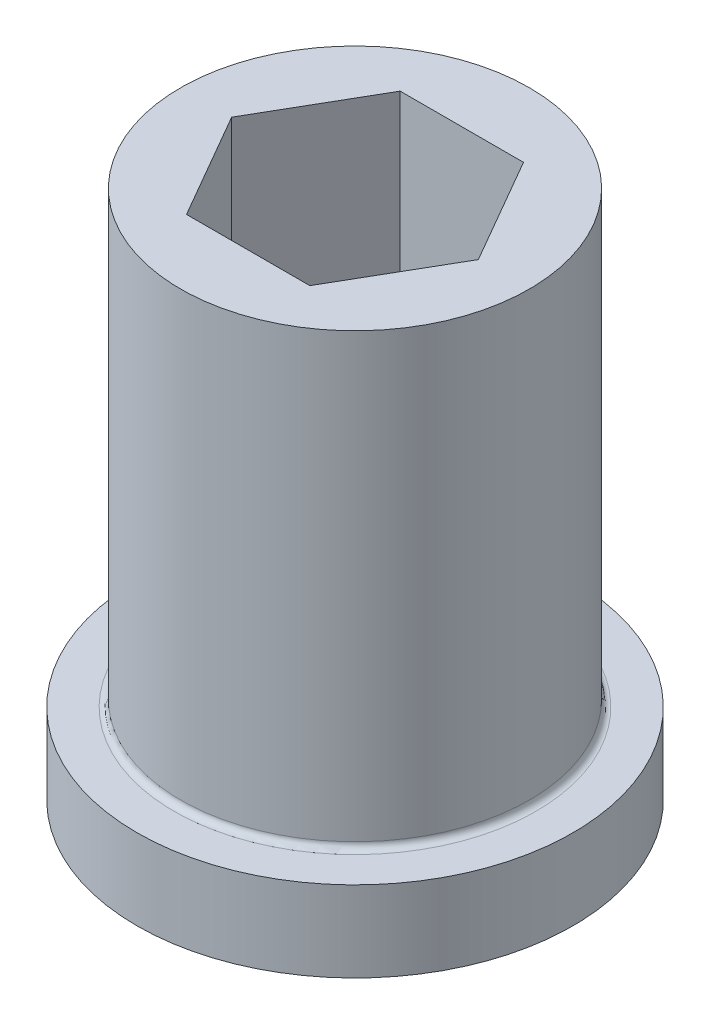
ISO-10303-21;
HEADER;
FILE_DESCRIPTION(('STEP AP214'),'2;1');
FILE_NAME('part.step','',(''),(''),'','','');
FILE_SCHEMA(('AUTOMOTIVE_DESIGN { 1 0 10303 214 1 1 1 1 }'));
ENDSEC;
DATA;
#1=APPLICATION_CONTEXT('core data for automotive mechanical design processes');
#2=APPLICATION_PROTOCOL_DEFINITION('international standard','automotive_design',2000,#1);
#3=PRODUCT_CONTEXT('',#1,'mechanical');
#4=PRODUCT('Part','Part','',(#3));
#5=PRODUCT_RELATED_PRODUCT_CATEGORY('part','',(#4));
#6=PRODUCT_DEFINITION_FORMATION('','',#4);
#7=PRODUCT_DEFINITION_CONTEXT('part definition',#1,'design');
#8=PRODUCT_DEFINITION('design','',#6,#7);
#9=PRODUCT_DEFINITION_SHAPE('','',#8);
#10=(LENGTH_UNIT() NAMED_UNIT(*) SI_UNIT(.MILLI.,.METRE.));
#11=(NAMED_UNIT(*) PLANE_ANGLE_UNIT() SI_UNIT($,.RADIAN.));
#12=(NAMED_UNIT(*) SI_UNIT($,.STERADIAN.) SOLID_ANGLE_UNIT());
#13=UNCERTAINTY_MEASURE_WITH_UNIT(LENGTH_MEASURE(1.E-05),#10,'distance_accuracy_value','');
#14=(GEOMETRIC_REPRESENTATION_CONTEXT(3) GLOBAL_UNCERTAINTY_ASSIGNED_CONTEXT((#13)) GLOBAL_UNIT_ASSIGNED_CONTEXT((#10,
#11,#12)) REPRESENTATION_CONTEXT('',''));
#15=CARTESIAN_POINT('',(0.,0.,0.));
#16=DIRECTION('',(0.,0.,1.));
#17=DIRECTION('',(1.,0.,0.));
#18=AXIS2_PLACEMENT_3D('',#15,#16,#17);
#19=CARTESIAN_POINT('',(0.,10.3,0.));
#20=DIRECTION('',(0.,1.,0.));
#21=DIRECTION('',(0.,0.,1.));
#22=AXIS2_PLACEMENT_3D('',#19,#20,#21);
#23=PLANE('',#22);
#24=CARTESIAN_POINT('',(0.,10.3,0.));
#25=DIRECTION('',(0.,1.,0.));
#26=DIRECTION('',(0.,0.,1.));
#27=AXIS2_PLACEMENT_3D('',#24,#25,#26);
#28=CIRCLE('',#27,4.);
#29=CARTESIAN_POINT('',(0.,10.3,-4.));
#30=VERTEX_POINT('',#29);
#31=EDGE_CURVE('E101',#30,#30,#28,.T.);
#32=ORIENTED_EDGE('',*,*,#31,.T.);
#33=EDGE_LOOP('',(#32));
#34=FACE_BOUND('',#33,.T.);
#35=DIRECTION('',(-0.500000000000001,0.,-0.866025403784438));
#36=VECTOR('',#35,1.);
#37=CARTESIAN_POINT('',(2.82901631902915,10.3,0.));
#38=LINE('',#37,#36);
#39=CARTESIAN_POINT('',(2.82901631902915,10.3,0.));
#40=VERTEX_POINT('',#39);
#41=CARTESIAN_POINT('',(1.41450815951457,10.3,-2.44999999999999));
#42=VERTEX_POINT('',#41);
#43=EDGE_CURVE('E133',#40,#42,#38,.T.);
#44=ORIENTED_EDGE('',*,*,#43,.F.);
#45=DIRECTION('',(0.499999999999995,0.,-0.866025403784442));
#46=VECTOR('',#45,1.);
#47=CARTESIAN_POINT('',(1.4145081595146,10.3,2.44999999999997));
#48=LINE('',#47,#46);
#49=CARTESIAN_POINT('',(1.4145081595146,10.3,2.44999999999997));
#50=VERTEX_POINT('',#49);
#51=EDGE_CURVE('E98',#50,#40,#48,.T.);
#52=ORIENTED_EDGE('',*,*,#51,.F.);
#53=DIRECTION('',(1.,0.,0.));
#54=VECTOR('',#53,1.);
#55=CARTESIAN_POINT('',(-1.41450815951455,10.3,2.45));
#56=LINE('',#55,#54);
#57=CARTESIAN_POINT('',(-1.41450815951455,10.3,2.45));
#58=VERTEX_POINT('',#57);
#59=EDGE_CURVE('E59',#58,#50,#56,.T.);
#60=ORIENTED_EDGE('',*,*,#59,.F.);
#61=DIRECTION('',(0.500000000000007,0.,0.866025403784435));
#62=VECTOR('',#61,1.);
#63=CARTESIAN_POINT('',(-2.82901631902915,10.3,0.));
#64=LINE('',#63,#62);
#65=CARTESIAN_POINT('',(-2.82901631902915,10.3,0.));
#66=VERTEX_POINT('',#65);
#67=EDGE_CURVE('E139',#66,#58,#64,.T.);
#68=ORIENTED_EDGE('',*,*,#67,.F.);
#69=DIRECTION('',(-0.499999999999995,0.,0.866025403784442));
#70=VECTOR('',#69,1.);
#71=CARTESIAN_POINT('',(-1.41450815951459,10.3,-2.44999999999998));
#72=LINE('',#71,#70);
#73=CARTESIAN_POINT('',(-1.41450815951459,10.3,-2.44999999999998));
#74=VERTEX_POINT('',#73);
#75=EDGE_CURVE('E137',#74,#66,#72,.T.);
#76=ORIENTED_EDGE('',*,*,#75,.F.);
#77=DIRECTION('',(-1.,0.,0.));
#78=VECTOR('',#77,1.);
#79=CARTESIAN_POINT('',(1.41450815951457,10.3,-2.44999999999999));
#80=LINE('',#79,#78);
#81=EDGE_CURVE('E135',#42,#74,#80,.T.);
#82=ORIENTED_EDGE('',*,*,#81,.F.);
#83=EDGE_LOOP('',(#44,#52,#60,#68,#76,#82));
#84=FACE_BOUND('',#83,.T.);
#85=ADVANCED_FACE('F39',(#34,#84),#23,.T.);
#86=CARTESIAN_POINT('',(0.,10.3,0.));
#87=DIRECTION('',(0.,-1.,0.));
#88=DIRECTION('',(0.,0.,-1.));
#89=AXIS2_PLACEMENT_3D('',#86,#87,#88);
#90=CYLINDRICAL_SURFACE('',#89,4.);
#91=CARTESIAN_POINT('',(0.,0.150000000000001,0.));
#92=DIRECTION('',(0.,-1.,0.));
#93=DIRECTION('',(0.,0.,-1.));
#94=AXIS2_PLACEMENT_3D('',#91,#92,#93);
#95=CIRCLE('',#94,4.);
#96=CARTESIAN_POINT('',(0.,0.150000000000003,-4.));
#97=VERTEX_POINT('',#96);
#98=EDGE_CURVE('E47',#97,#97,#95,.F.);
#99=CARTESIAN_POINT('',(0.,0.150000000000003,-4.));
#100=CARTESIAN_POINT('',(0.,0.255729166666669,-4.));
#101=CARTESIAN_POINT('',(0.,0.361458333333336,-4.));
#102=CARTESIAN_POINT('',(0.,0.572916666666669,-4.));
#103=CARTESIAN_POINT('',(0.,0.678645833333336,-4.));
#104=CARTESIAN_POINT('',(0.,0.890104166666669,-4.));
#105=CARTESIAN_POINT('',(0.,0.995833333333335,-4.));
#106=CARTESIAN_POINT('',(0.,1.20729166666667,-4.));
#107=CARTESIAN_POINT('',(0.,1.31302083333334,-4.));
#108=CARTESIAN_POINT('',(0.,1.52447916666667,-4.));
#109=CARTESIAN_POINT('',(0.,1.63020833333334,-4.));
#110=CARTESIAN_POINT('',(0.,1.84166666666667,-4.));
#111=CARTESIAN_POINT('',(0.,1.94739583333334,-4.));
#112=CARTESIAN_POINT('',(0.,2.15885416666667,-4.));
#113=CARTESIAN_POINT('',(0.,2.26458333333334,-4.));
#114=CARTESIAN_POINT('',(0.,2.47604166666667,-4.));
#115=CARTESIAN_POINT('',(0.,2.58177083333334,-4.));
#116=CARTESIAN_POINT('',(0.,2.79322916666667,-4.));
#117=CARTESIAN_POINT('',(0.,2.89895833333333,-4.));
#118=CARTESIAN_POINT('',(0.,3.11041666666667,-4.));
#119=CARTESIAN_POINT('',(0.,3.21614583333333,-4.));
#120=CARTESIAN_POINT('',(0.,3.42760416666667,-4.));
#121=CARTESIAN_POINT('',(0.,3.53333333333333,-4.));
#122=CARTESIAN_POINT('',(0.,3.74479166666667,-4.));
#123=CARTESIAN_POINT('',(0.,3.85052083333333,-4.));
#124=CARTESIAN_POINT('',(0.,4.06197916666667,-4.));
#125=CARTESIAN_POINT('',(0.,4.16770833333333,-4.));
#126=CARTESIAN_POINT('',(0.,4.37916666666667,-4.));
#127=CARTESIAN_POINT('',(0.,4.48489583333333,-4.));
#128=CARTESIAN_POINT('',(0.,4.69635416666667,-4.));
#129=CARTESIAN_POINT('',(0.,4.80208333333334,-4.));
#130=CARTESIAN_POINT('',(0.,5.01354166666667,-4.));
#131=CARTESIAN_POINT('',(0.,5.11927083333333,-4.));
#132=CARTESIAN_POINT('',(0.,5.33072916666667,-4.));
#133=CARTESIAN_POINT('',(0.,5.43645833333334,-4.));
#134=CARTESIAN_POINT('',(0.,5.64791666666667,-4.));
#135=CARTESIAN_POINT('',(0.,5.75364583333333,-4.));
#136=CARTESIAN_POINT('',(0.,5.96510416666667,-4.));
#137=CARTESIAN_POINT('',(0.,6.07083333333333,-4.));
#138=CARTESIAN_POINT('',(0.,6.28229166666667,-4.));
#139=CARTESIAN_POINT('',(0.,6.38802083333333,-4.));
#140=CARTESIAN_POINT('',(0.,6.59947916666667,-4.));
#141=CARTESIAN_POINT('',(0.,6.70520833333333,-4.));
#142=CARTESIAN_POINT('',(0.,6.91666666666667,-4.));
#143=CARTESIAN_POINT('',(0.,7.02239583333333,-4.));
#144=CARTESIAN_POINT('',(0.,7.23385416666667,-4.));
#145=CARTESIAN_POINT('',(0.,7.33958333333333,-4.));
#146=CARTESIAN_POINT('',(0.,7.55104166666667,-4.));
#147=CARTESIAN_POINT('',(0.,7.65677083333333,-4.));
#148=CARTESIAN_POINT('',(0.,7.86822916666667,-4.));
#149=CARTESIAN_POINT('',(0.,7.97395833333333,-4.));
#150=CARTESIAN_POINT('',(0.,8.18541666666667,-4.));
#151=CARTESIAN_POINT('',(0.,8.29114583333333,-4.));
#152=CARTESIAN_POINT('',(0.,8.50260416666667,-4.));
#153=CARTESIAN_POINT('',(0.,8.60833333333333,-4.));
#154=CARTESIAN_POINT('',(0.,8.81979166666667,-4.));
#155=CARTESIAN_POINT('',(0.,8.92552083333333,-4.));
#156=CARTESIAN_POINT('',(0.,9.13697916666667,-4.));
#157=CARTESIAN_POINT('',(0.,9.24270833333333,-4.));
#158=CARTESIAN_POINT('',(0.,9.45416666666667,-4.));
#159=CARTESIAN_POINT('',(0.,9.55989583333333,-4.));
#160=CARTESIAN_POINT('',(0.,9.77135416666667,-4.));
#161=CARTESIAN_POINT('',(0.,9.87708333333333,-4.));
#162=CARTESIAN_POINT('',(0.,10.0885416666667,-4.));
#163=CARTESIAN_POINT('',(0.,10.1942708333333,-4.));
#164=CARTESIAN_POINT('',(0.,10.3,-4.));
#165=B_SPLINE_CURVE_WITH_KNOTS('',3,(#99,#100,#101,#102,#103,#104,#105,#106,#107,#108,#109,#110,
#111,#112,#113,#114,#115,#116,#117,#118,#119,#120,#121,#122,#123,#124,#125,#126,#127,#128,#129,
#130,#131,#132,#133,#134,#135,#136,#137,#138,#139,#140,#141,#142,#143,#144,#145,#146,#147,#148,
#149,#150,#151,#152,#153,#154,#155,#156,#157,#158,#159,#160,#161,#162,#163,#164),.UNSPECIFIED.,
.F.,.F.,(4,2,2,2,2,2,2,2,2,2,2,2,2,2,2,2,2,2,2,2,2,2,2,2,2,2,2,2,2,2,2,2,4),(0.,0.3171875,
0.634374999999999,0.951562499999999,1.26875,1.5859375,1.903125,2.2203125,2.5375,2.8546875,
3.171875,3.4890625,3.80625,4.1234375,4.440625,4.7578125,5.075,5.3921875,5.709375,6.0265625,
6.34375,6.6609375,6.978125,7.2953125,7.6125,7.9296875,8.246875,8.5640625,8.88125,9.1984375,
9.515625,9.8328125,10.15),.UNSPECIFIED.);
#166=EDGE_CURVE('BSEAM154',#97,#30,#165,.T.);
#167=ORIENTED_EDGE('',*,*,#98,.T.);
#168=ORIENTED_EDGE('',*,*,#31,.F.);
#169=ORIENTED_EDGE('',*,*,#166,.T.);
#170=ORIENTED_EDGE('',*,*,#166,.F.);
#171=EDGE_LOOP('',(#167,#169,#168,#170));
#172=FACE_BOUND('',#171,.T.);
#173=ADVANCED_FACE('F154',(#172),#90,.T.);
#174=CARTESIAN_POINT('',(1.4145081595146,10.3,2.44999999999997));
#175=DIRECTION('',(-0.866025403784441,0.,-0.499999999999995));
#176=DIRECTION('',(-0.499999999999995,0.,0.866025403784442));
#177=AXIS2_PLACEMENT_3D('',#174,#175,#176);
#178=PLANE('',#177);
#179=DIRECTION('',(0.,-1.,0.));
#180=VECTOR('',#179,1.);
#181=CARTESIAN_POINT('',(2.82901631902915,10.3,0.));
#182=LINE('',#181,#180);
#183=CARTESIAN_POINT('',(2.82901631902915,-1.85,0.));
#184=VERTEX_POINT('',#183);
#185=EDGE_CURVE('E91',#40,#184,#182,.T.);
#186=ORIENTED_EDGE('',*,*,#185,.T.);
#187=DIRECTION('',(-0.500000000000001,0.,0.866025403784438));
#188=VECTOR('',#187,1.);
#189=CARTESIAN_POINT('',(2.82901631902915,-1.85,0.));
#190=LINE('',#189,#188);
#191=CARTESIAN_POINT('',(1.41450815951457,-1.85,2.44999999999999));
#192=VERTEX_POINT('',#191);
#193=EDGE_CURVE('E95',#184,#192,#190,.T.);
#194=ORIENTED_EDGE('',*,*,#193,.T.);
#195=DIRECTION('',(0.,-1.,0.));
#196=VECTOR('',#195,1.);
#197=CARTESIAN_POINT('',(1.4145081595146,10.3,2.44999999999997));
#198=LINE('',#197,#196);
#199=EDGE_CURVE('E142',#50,#192,#198,.T.);
#200=ORIENTED_EDGE('',*,*,#199,.F.);
#201=ORIENTED_EDGE('',*,*,#51,.T.);
#202=EDGE_LOOP('',(#186,#194,#200,#201));
#203=FACE_BOUND('',#202,.T.);
#204=ADVANCED_FACE('F93',(#203),#178,.T.);
#205=CARTESIAN_POINT('',(2.82901631902915,10.3,0.));
#206=DIRECTION('',(-0.866025403784438,0.,0.500000000000001));
#207=DIRECTION('',(0.500000000000001,0.,0.866025403784438));
#208=AXIS2_PLACEMENT_3D('',#205,#206,#207);
#209=PLANE('',#208);
#210=DIRECTION('',(0.,-1.,0.));
#211=VECTOR('',#210,1.);
#212=CARTESIAN_POINT('',(1.41450815951457,10.3,-2.44999999999999));
#213=LINE('',#212,#211);
#214=CARTESIAN_POINT('',(1.4145081595146,-1.85,-2.44999999999997));
#215=VERTEX_POINT('',#214);
#216=EDGE_CURVE('E102',#42,#215,#213,.T.);
#217=ORIENTED_EDGE('',*,*,#216,.T.);
#218=DIRECTION('',(0.499999999999995,0.,0.866025403784442));
#219=VECTOR('',#218,1.);
#220=CARTESIAN_POINT('',(1.4145081595146,-1.85,-2.44999999999997));
#221=LINE('',#220,#219);
#222=EDGE_CURVE('E105',#215,#184,#221,.T.);
#223=ORIENTED_EDGE('',*,*,#222,.T.);
#224=ORIENTED_EDGE('',*,*,#185,.F.);
#225=ORIENTED_EDGE('',*,*,#43,.T.);
#226=EDGE_LOOP('',(#217,#223,#224,#225));
#227=FACE_BOUND('',#226,.T.);
#228=ADVANCED_FACE('F106',(#227),#209,.T.);
#229=CARTESIAN_POINT('',(1.41450815951457,10.3,-2.44999999999999));
#230=DIRECTION('',(0.,0.,1.));
#231=DIRECTION('',(1.,0.,0.));
#232=AXIS2_PLACEMENT_3D('',#229,#230,#231);
#233=PLANE('',#232);
#234=DIRECTION('',(0.,-1.,0.));
#235=VECTOR('',#234,1.);
#236=CARTESIAN_POINT('',(-1.41450815951459,10.3,-2.44999999999998));
#237=LINE('',#236,#235);
#238=CARTESIAN_POINT('',(-1.41450815951455,-1.85,-2.45));
#239=VERTEX_POINT('',#238);
#240=EDGE_CURVE('E147',#74,#239,#237,.T.);
#241=ORIENTED_EDGE('',*,*,#240,.T.);
#242=DIRECTION('',(1.,0.,0.));
#243=VECTOR('',#242,1.);
#244=CARTESIAN_POINT('',(-1.41450815951455,-1.85,-2.45));
#245=LINE('',#244,#243);
#246=EDGE_CURVE('E124',#239,#215,#245,.T.);
#247=ORIENTED_EDGE('',*,*,#246,.T.);
#248=ORIENTED_EDGE('',*,*,#216,.F.);
#249=ORIENTED_EDGE('',*,*,#81,.T.);
#250=EDGE_LOOP('',(#241,#247,#248,#249));
#251=FACE_BOUND('',#250,.T.);
#252=ADVANCED_FACE('F180',(#251),#233,.T.);
#253=CARTESIAN_POINT('',(-1.41450815951459,10.3,-2.44999999999998));
#254=DIRECTION('',(0.866025403784441,0.,0.499999999999995));
#255=DIRECTION('',(0.499999999999995,0.,-0.866025403784442));
#256=AXIS2_PLACEMENT_3D('',#253,#254,#255);
#257=PLANE('',#256);
#258=DIRECTION('',(0.,-1.,0.));
#259=VECTOR('',#258,1.);
#260=CARTESIAN_POINT('',(-2.82901631902915,10.3,0.));
#261=LINE('',#260,#259);
#262=CARTESIAN_POINT('',(-2.82901631902915,-1.85,0.));
#263=VERTEX_POINT('',#262);
#264=EDGE_CURVE('E145',#66,#263,#261,.T.);
#265=ORIENTED_EDGE('',*,*,#264,.T.);
#266=DIRECTION('',(0.500000000000007,0.,-0.866025403784435));
#267=VECTOR('',#266,1.);
#268=CARTESIAN_POINT('',(-2.82901631902915,-1.85,0.));
#269=LINE('',#268,#267);
#270=EDGE_CURVE('E121',#263,#239,#269,.T.);
#271=ORIENTED_EDGE('',*,*,#270,.T.);
#272=ORIENTED_EDGE('',*,*,#240,.F.);
#273=ORIENTED_EDGE('',*,*,#75,.T.);
#274=EDGE_LOOP('',(#265,#271,#272,#273));
#275=FACE_BOUND('',#274,.T.);
#276=ADVANCED_FACE('F183',(#275),#257,.T.);
#277=CARTESIAN_POINT('',(-2.82901631902915,10.3,0.));
#278=DIRECTION('',(0.866025403784434,0.,-0.500000000000007));
#279=DIRECTION('',(-0.500000000000007,0.,-0.866025403784435));
#280=AXIS2_PLACEMENT_3D('',#277,#278,#279);
#281=PLANE('',#280);
#282=DIRECTION('',(0.,-1.,0.));
#283=VECTOR('',#282,1.);
#284=CARTESIAN_POINT('',(-1.41450815951455,10.3,2.45));
#285=LINE('',#284,#283);
#286=CARTESIAN_POINT('',(-1.41450815951459,-1.85,2.44999999999998));
#287=VERTEX_POINT('',#286);
#288=EDGE_CURVE('E54',#58,#287,#285,.T.);
#289=ORIENTED_EDGE('',*,*,#288,.T.);
#290=DIRECTION('',(-0.499999999999995,0.,-0.866025403784442));
#291=VECTOR('',#290,1.);
#292=CARTESIAN_POINT('',(-1.41450815951459,-1.85,2.44999999999998));
#293=LINE('',#292,#291);
#294=EDGE_CURVE('E116',#287,#263,#293,.T.);
#295=ORIENTED_EDGE('',*,*,#294,.T.);
#296=ORIENTED_EDGE('',*,*,#264,.F.);
#297=ORIENTED_EDGE('',*,*,#67,.T.);
#298=EDGE_LOOP('',(#289,#295,#296,#297));
#299=FACE_BOUND('',#298,.T.);
#300=ADVANCED_FACE('F187',(#299),#281,.T.);
#301=CARTESIAN_POINT('',(-1.41450815951455,10.3,2.45));
#302=DIRECTION('',(0.,0.,-1.));
#303=DIRECTION('',(-1.,0.,0.));
#304=AXIS2_PLACEMENT_3D('',#301,#302,#303);
#305=PLANE('',#304);
#306=ORIENTED_EDGE('',*,*,#199,.T.);
#307=DIRECTION('',(-1.,0.,0.));
#308=VECTOR('',#307,1.);
#309=CARTESIAN_POINT('',(1.41450815951457,-1.85,2.44999999999999));
#310=LINE('',#309,#308);
#311=EDGE_CURVE('E114',#192,#287,#310,.T.);
#312=ORIENTED_EDGE('',*,*,#311,.T.);
#313=ORIENTED_EDGE('',*,*,#288,.F.);
#314=ORIENTED_EDGE('',*,*,#59,.T.);
#315=EDGE_LOOP('',(#306,#312,#313,#314));
#316=FACE_BOUND('',#315,.T.);
#317=ADVANCED_FACE('F191',(#316),#305,.T.);
#318=CARTESIAN_POINT('',(0.,-1.85,0.));
#319=DIRECTION('',(0.,-1.,0.));
#320=DIRECTION('',(0.,0.,-1.));
#321=AXIS2_PLACEMENT_3D('',#318,#319,#320);
#322=PLANE('',#321);
#323=CARTESIAN_POINT('',(0.,-1.85,0.));
#324=DIRECTION('',(0.,-1.,0.));
#325=DIRECTION('',(0.,0.,-1.));
#326=AXIS2_PLACEMENT_3D('',#323,#324,#325);
#327=CIRCLE('',#326,5.);
#328=CARTESIAN_POINT('',(0.,-1.85,-5.));
#329=VERTEX_POINT('',#328);
#330=EDGE_CURVE('E127',#329,#329,#327,.T.);
#331=ORIENTED_EDGE('',*,*,#330,.T.);
#332=EDGE_LOOP('',(#331));
#333=FACE_BOUND('',#332,.T.);
#334=ORIENTED_EDGE('',*,*,#193,.F.);
#335=ORIENTED_EDGE('',*,*,#222,.F.);
#336=ORIENTED_EDGE('',*,*,#246,.F.);
#337=ORIENTED_EDGE('',*,*,#270,.F.);
#338=ORIENTED_EDGE('',*,*,#294,.F.);
#339=ORIENTED_EDGE('',*,*,#311,.F.);
#340=EDGE_LOOP('',(#334,#335,#336,#337,#338,#339));
#341=FACE_BOUND('',#340,.T.);
#342=ADVANCED_FACE('F112',(#333,#341),#322,.T.);
#343=CARTESIAN_POINT('',(0.,0.,0.));
#344=DIRECTION('',(0.,-1.,0.));
#345=DIRECTION('',(0.,0.,-1.));
#346=AXIS2_PLACEMENT_3D('',#343,#344,#345);
#347=PLANE('',#346);
#348=CARTESIAN_POINT('',(0.,0.,0.));
#349=DIRECTION('',(0.,-1.,0.));
#350=DIRECTION('',(0.,0.,-1.));
#351=AXIS2_PLACEMENT_3D('',#348,#349,#350);
#352=CIRCLE('',#351,4.15);
#353=CARTESIAN_POINT('',(0.,0.,-4.15));
#354=VERTEX_POINT('',#353);
#355=EDGE_CURVE('E11',#354,#354,#352,.T.);
#356=ORIENTED_EDGE('',*,*,#355,.T.);
#357=EDGE_LOOP('',(#356));
#358=FACE_BOUND('',#357,.T.);
#359=CARTESIAN_POINT('',(0.,0.,0.));
#360=DIRECTION('',(0.,-1.,0.));
#361=DIRECTION('',(0.,0.,-1.));
#362=AXIS2_PLACEMENT_3D('',#359,#360,#361);
#363=CIRCLE('',#362,5.);
#364=CARTESIAN_POINT('',(0.,0.,-5.));
#365=VERTEX_POINT('',#364);
#366=EDGE_CURVE('E126',#365,#365,#363,.T.);
#367=ORIENTED_EDGE('',*,*,#366,.F.);
#368=EDGE_LOOP('',(#367));
#369=FACE_BOUND('',#368,.T.);
#370=ADVANCED_FACE('F164',(#358,#369),#347,.F.);
#371=CARTESIAN_POINT('',(0.,-1.85,0.));
#372=DIRECTION('',(0.,1.,0.));
#373=DIRECTION('',(0.,0.,1.));
#374=AXIS2_PLACEMENT_3D('',#371,#372,#373);
#375=CYLINDRICAL_SURFACE('',#374,5.);
#376=ORIENTED_EDGE('',*,*,#330,.F.);
#377=EDGE_LOOP('',(#376));
#378=FACE_BOUND('',#377,.T.);
#379=ORIENTED_EDGE('',*,*,#366,.T.);
#380=EDGE_LOOP('',(#379));
#381=FACE_BOUND('',#380,.T.);
#382=ADVANCED_FACE('F158',(#378,#381),#375,.T.);
#383=CARTESIAN_POINT('',(0.,0.150000000000001,0.));
#384=DIRECTION('',(0.,-1.,0.));
#385=DIRECTION('',(0.,0.,-1.));
#386=AXIS2_PLACEMENT_3D('',#383,#384,#385);
#387=TOROIDAL_SURFACE('',#386,4.15,0.15);
#388=ORIENTED_EDGE('',*,*,#355,.F.);
#389=EDGE_LOOP('',(#388));
#390=FACE_BOUND('',#389,.T.);
#391=ORIENTED_EDGE('',*,*,#98,.F.);
#392=EDGE_LOOP('',(#391));
#393=FACE_BOUND('',#392,.T.);
#394=ADVANCED_FACE('F41',(#390,#393),#387,.F.);
#395=CLOSED_SHELL('',(#85,#173,#204,#228,#252,#276,#300,#317,#342,#370,#382,#394));
#396=MANIFOLD_SOLID_BREP('B2',#395);
#397=ADVANCED_BREP_SHAPE_REPRESENTATION('',(#18,#396),#14);
#398=SHAPE_DEFINITION_REPRESENTATION(#9,#397);
ENDSEC;
END-ISO-10303-21;
